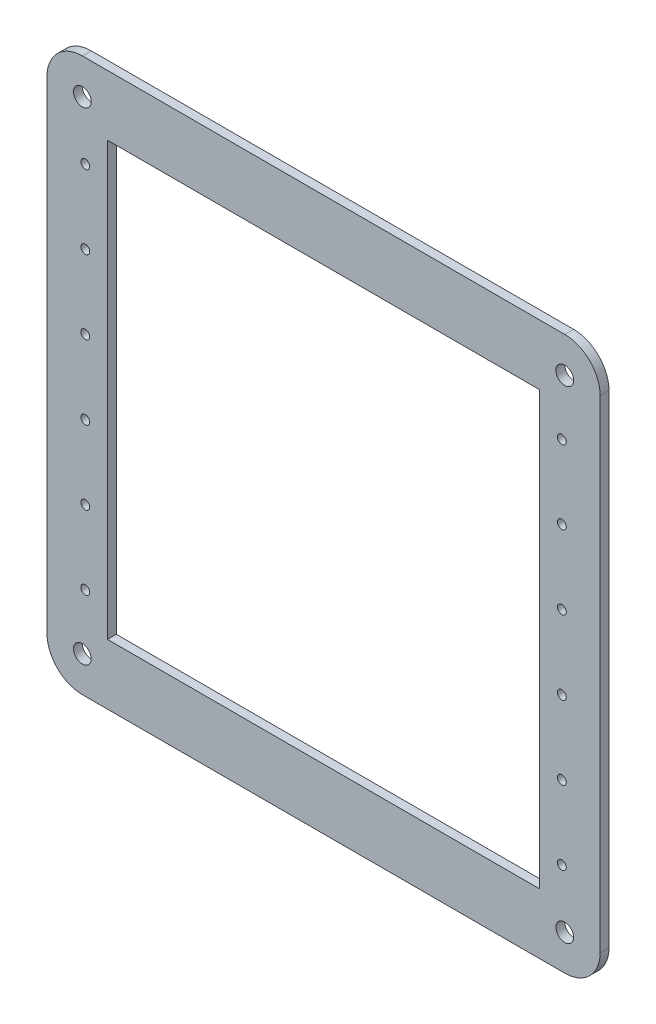
ISO-10303-21;
HEADER;
FILE_DESCRIPTION(('STEP AP214'),'2;1');
FILE_NAME('part.step','',(''),(''),'','','');
FILE_SCHEMA(('AUTOMOTIVE_DESIGN { 1 0 10303 214 1 1 1 1 }'));
ENDSEC;
DATA;
#1=APPLICATION_CONTEXT('core data for automotive mechanical design processes');
#2=APPLICATION_PROTOCOL_DEFINITION('international standard','automotive_design',2000,#1);
#3=PRODUCT_CONTEXT('',#1,'mechanical');
#4=PRODUCT('Part','Part','',(#3));
#5=PRODUCT_RELATED_PRODUCT_CATEGORY('part','',(#4));
#6=PRODUCT_DEFINITION_FORMATION('','',#4);
#7=PRODUCT_DEFINITION_CONTEXT('part definition',#1,'design');
#8=PRODUCT_DEFINITION('design','',#6,#7);
#9=PRODUCT_DEFINITION_SHAPE('','',#8);
#10=(LENGTH_UNIT() NAMED_UNIT(*) SI_UNIT(.MILLI.,.METRE.));
#11=(NAMED_UNIT(*) PLANE_ANGLE_UNIT() SI_UNIT($,.RADIAN.));
#12=(NAMED_UNIT(*) SI_UNIT($,.STERADIAN.) SOLID_ANGLE_UNIT());
#13=UNCERTAINTY_MEASURE_WITH_UNIT(LENGTH_MEASURE(1.E-05),#10,'distance_accuracy_value','');
#14=(GEOMETRIC_REPRESENTATION_CONTEXT(3) GLOBAL_UNCERTAINTY_ASSIGNED_CONTEXT((#13)) GLOBAL_UNIT_ASSIGNED_CONTEXT((#10,
#11,#12)) REPRESENTATION_CONTEXT('',''));
#15=CARTESIAN_POINT('',(0.,0.,0.));
#16=DIRECTION('',(0.,0.,1.));
#17=DIRECTION('',(1.,0.,0.));
#18=AXIS2_PLACEMENT_3D('',#15,#16,#17);
#19=CARTESIAN_POINT('',(-109.,-109.,4.));
#20=DIRECTION('',(0.,0.,1.));
#21=DIRECTION('',(1.,0.,0.));
#22=AXIS2_PLACEMENT_3D('',#19,#20,#21);
#23=PLANE('',#22);
#24=CARTESIAN_POINT('',(107.686291501015,-16.7000000000003,4.));
#25=DIRECTION('',(0.,0.,1.));
#26=DIRECTION('',(1.,0.,0.));
#27=AXIS2_PLACEMENT_3D('',#24,#25,#26);
#28=CIRCLE('',#27,2.);
#29=CARTESIAN_POINT('',(109.686291501015,-16.7000000000003,4.));
#30=VERTEX_POINT('',#29);
#31=EDGE_CURVE('E614',#30,#30,#28,.T.);
#32=ORIENTED_EDGE('',*,*,#31,.F.);
#33=EDGE_LOOP('',(#32));
#34=FACE_BOUND('',#33,.T.);
#35=CARTESIAN_POINT('',(107.686291501015,-50.0000000000003,4.));
#36=DIRECTION('',(0.,0.,1.));
#37=DIRECTION('',(1.,0.,0.));
#38=AXIS2_PLACEMENT_3D('',#35,#36,#37);
#39=CIRCLE('',#38,2.);
#40=CARTESIAN_POINT('',(109.686291501015,-50.0000000000003,4.));
#41=VERTEX_POINT('',#40);
#42=EDGE_CURVE('E615',#41,#41,#39,.T.);
#43=ORIENTED_EDGE('',*,*,#42,.F.);
#44=EDGE_LOOP('',(#43));
#45=FACE_BOUND('',#44,.T.);
#46=CARTESIAN_POINT('',(107.686291501015,-83.3000000000003,4.));
#47=DIRECTION('',(0.,0.,1.));
#48=DIRECTION('',(1.,0.,0.));
#49=AXIS2_PLACEMENT_3D('',#46,#47,#48);
#50=CIRCLE('',#49,2.00000000000001);
#51=CARTESIAN_POINT('',(109.686291501015,-83.3000000000003,4.));
#52=VERTEX_POINT('',#51);
#53=EDGE_CURVE('E619',#52,#52,#50,.T.);
#54=ORIENTED_EDGE('',*,*,#53,.F.);
#55=EDGE_LOOP('',(#54));
#56=FACE_BOUND('',#55,.T.);
#57=CARTESIAN_POINT('',(-107.686291501015,-83.3000000000003,4.));
#58=DIRECTION('',(0.,0.,1.));
#59=DIRECTION('',(1.,0.,0.));
#60=AXIS2_PLACEMENT_3D('',#57,#58,#59);
#61=CIRCLE('',#60,2.);
#62=CARTESIAN_POINT('',(-105.686291501015,-83.3000000000003,4.));
#63=VERTEX_POINT('',#62);
#64=EDGE_CURVE('E637',#63,#63,#61,.T.);
#65=ORIENTED_EDGE('',*,*,#64,.F.);
#66=EDGE_LOOP('',(#65));
#67=FACE_BOUND('',#66,.T.);
#68=CARTESIAN_POINT('',(-107.686291501015,-50.0000000000003,4.));
#69=DIRECTION('',(0.,0.,1.));
#70=DIRECTION('',(1.,0.,0.));
#71=AXIS2_PLACEMENT_3D('',#68,#69,#70);
#72=CIRCLE('',#71,2.00000000000001);
#73=CARTESIAN_POINT('',(-105.686291501015,-50.0000000000003,4.));
#74=VERTEX_POINT('',#73);
#75=EDGE_CURVE('E635',#74,#74,#72,.T.);
#76=ORIENTED_EDGE('',*,*,#75,.F.);
#77=EDGE_LOOP('',(#76));
#78=FACE_BOUND('',#77,.T.);
#79=CARTESIAN_POINT('',(-107.686291501015,-16.7000000000003,4.));
#80=DIRECTION('',(0.,0.,1.));
#81=DIRECTION('',(1.,0.,0.));
#82=AXIS2_PLACEMENT_3D('',#79,#80,#81);
#83=CIRCLE('',#82,2.);
#84=CARTESIAN_POINT('',(-105.686291501015,-16.7000000000003,4.));
#85=VERTEX_POINT('',#84);
#86=EDGE_CURVE('E632',#85,#85,#83,.T.);
#87=ORIENTED_EDGE('',*,*,#86,.F.);
#88=EDGE_LOOP('',(#87));
#89=FACE_BOUND('',#88,.T.);
#90=CARTESIAN_POINT('',(-107.686291501015,16.7000000000004,4.));
#91=DIRECTION('',(0.,0.,1.));
#92=DIRECTION('',(1.,0.,0.));
#93=AXIS2_PLACEMENT_3D('',#90,#91,#92);
#94=CIRCLE('',#93,2.00000000000001);
#95=CARTESIAN_POINT('',(-105.686291501015,16.7000000000004,4.));
#96=VERTEX_POINT('',#95);
#97=EDGE_CURVE('E629',#96,#96,#94,.T.);
#98=ORIENTED_EDGE('',*,*,#97,.F.);
#99=EDGE_LOOP('',(#98));
#100=FACE_BOUND('',#99,.T.);
#101=CARTESIAN_POINT('',(-107.686291501015,50.0000000000004,4.));
#102=DIRECTION('',(0.,0.,1.));
#103=DIRECTION('',(1.,0.,0.));
#104=AXIS2_PLACEMENT_3D('',#101,#102,#103);
#105=CIRCLE('',#104,2.);
#106=CARTESIAN_POINT('',(-105.686291501015,50.0000000000004,4.));
#107=VERTEX_POINT('',#106);
#108=EDGE_CURVE('E626',#107,#107,#105,.T.);
#109=ORIENTED_EDGE('',*,*,#108,.F.);
#110=EDGE_LOOP('',(#109));
#111=FACE_BOUND('',#110,.T.);
#112=CARTESIAN_POINT('',(107.686291501015,16.7000000000004,4.));
#113=DIRECTION('',(0.,0.,1.));
#114=DIRECTION('',(1.,0.,0.));
#115=AXIS2_PLACEMENT_3D('',#112,#113,#114);
#116=CIRCLE('',#115,2.);
#117=CARTESIAN_POINT('',(109.686291501015,16.7000000000004,4.));
#118=VERTEX_POINT('',#117);
#119=EDGE_CURVE('E616',#118,#118,#116,.T.);
#120=ORIENTED_EDGE('',*,*,#119,.F.);
#121=EDGE_LOOP('',(#120));
#122=FACE_BOUND('',#121,.T.);
#123=CARTESIAN_POINT('',(107.686291501015,50.0000000000004,4.));
#124=DIRECTION('',(0.,0.,1.));
#125=DIRECTION('',(1.,0.,0.));
#126=AXIS2_PLACEMENT_3D('',#123,#124,#125);
#127=CIRCLE('',#126,2.00000000000001);
#128=CARTESIAN_POINT('',(109.686291501015,50.0000000000004,4.));
#129=VERTEX_POINT('',#128);
#130=EDGE_CURVE('E622',#129,#129,#127,.T.);
#131=ORIENTED_EDGE('',*,*,#130,.F.);
#132=EDGE_LOOP('',(#131));
#133=FACE_BOUND('',#132,.T.);
#134=CARTESIAN_POINT('',(107.686291501015,83.3000000000004,4.));
#135=DIRECTION('',(0.,0.,1.));
#136=DIRECTION('',(1.,0.,0.));
#137=AXIS2_PLACEMENT_3D('',#134,#135,#136);
#138=CIRCLE('',#137,2.);
#139=CARTESIAN_POINT('',(109.686291501015,83.3000000000004,4.));
#140=VERTEX_POINT('',#139);
#141=EDGE_CURVE('E650',#140,#140,#138,.T.);
#142=ORIENTED_EDGE('',*,*,#141,.F.);
#143=EDGE_LOOP('',(#142));
#144=FACE_BOUND('',#143,.T.);
#145=CARTESIAN_POINT('',(-107.686291501015,83.3000000000004,4.));
#146=DIRECTION('',(0.,0.,1.));
#147=DIRECTION('',(1.,0.,0.));
#148=AXIS2_PLACEMENT_3D('',#145,#146,#147);
#149=CIRCLE('',#148,2.00000000000001);
#150=CARTESIAN_POINT('',(-105.686291501015,83.3000000000004,4.));
#151=VERTEX_POINT('',#150);
#152=EDGE_CURVE('E224',#151,#151,#149,.T.);
#153=ORIENTED_EDGE('',*,*,#152,.F.);
#154=EDGE_LOOP('',(#153));
#155=FACE_BOUND('',#154,.T.);
#156=CARTESIAN_POINT('',(109.,-109.,4.));
#157=DIRECTION('',(0.,0.,1.));
#158=DIRECTION('',(1.,0.,0.));
#159=AXIS2_PLACEMENT_3D('',#156,#157,#158);
#160=CIRCLE('',#159,4.00000000000001);
#161=CARTESIAN_POINT('',(113.,-109.,4.));
#162=VERTEX_POINT('',#161);
#163=EDGE_CURVE('E268',#162,#162,#160,.T.);
#164=ORIENTED_EDGE('',*,*,#163,.F.);
#165=EDGE_LOOP('',(#164));
#166=FACE_BOUND('',#165,.T.);
#167=CARTESIAN_POINT('',(-109.,109.,4.));
#168=DIRECTION('',(0.,0.,1.));
#169=DIRECTION('',(1.,0.,0.));
#170=AXIS2_PLACEMENT_3D('',#167,#168,#169);
#171=CIRCLE('',#170,4.00000000000001);
#172=CARTESIAN_POINT('',(-105.,109.,4.));
#173=VERTEX_POINT('',#172);
#174=EDGE_CURVE('E157',#173,#173,#171,.T.);
#175=ORIENTED_EDGE('',*,*,#174,.F.);
#176=EDGE_LOOP('',(#175));
#177=FACE_BOUND('',#176,.T.);
#178=CARTESIAN_POINT('',(-109.,-109.,4.));
#179=DIRECTION('',(0.,0.,1.));
#180=DIRECTION('',(1.,0.,0.));
#181=AXIS2_PLACEMENT_3D('',#178,#179,#180);
#182=CIRCLE('',#181,16.);
#183=CARTESIAN_POINT('',(-125.,-109.,4.));
#184=VERTEX_POINT('',#183);
#185=CARTESIAN_POINT('',(-109.,-125.,4.));
#186=VERTEX_POINT('',#185);
#187=EDGE_CURVE('E167',#184,#186,#182,.T.);
#188=ORIENTED_EDGE('',*,*,#187,.T.);
#189=DIRECTION('',(1.,0.,0.));
#190=VECTOR('',#189,1.);
#191=CARTESIAN_POINT('',(-109.,-125.,4.));
#192=LINE('',#191,#190);
#193=CARTESIAN_POINT('',(109.,-125.,4.));
#194=VERTEX_POINT('',#193);
#195=EDGE_CURVE('E170',#186,#194,#192,.T.);
#196=ORIENTED_EDGE('',*,*,#195,.T.);
#197=CARTESIAN_POINT('',(109.,-109.,4.));
#198=DIRECTION('',(0.,0.,1.));
#199=DIRECTION('',(1.,0.,0.));
#200=AXIS2_PLACEMENT_3D('',#197,#198,#199);
#201=CIRCLE('',#200,16.);
#202=CARTESIAN_POINT('',(125.,-109.,4.));
#203=VERTEX_POINT('',#202);
#204=EDGE_CURVE('E173',#194,#203,#201,.T.);
#205=ORIENTED_EDGE('',*,*,#204,.T.);
#206=DIRECTION('',(0.,1.,0.));
#207=VECTOR('',#206,1.);
#208=CARTESIAN_POINT('',(125.,109.,4.));
#209=LINE('',#208,#207);
#210=CARTESIAN_POINT('',(125.,109.,4.));
#211=VERTEX_POINT('',#210);
#212=EDGE_CURVE('E175',#203,#211,#209,.T.);
#213=ORIENTED_EDGE('',*,*,#212,.T.);
#214=CARTESIAN_POINT('',(109.,109.,4.));
#215=DIRECTION('',(0.,0.,1.));
#216=DIRECTION('',(-1.,0.,0.));
#217=AXIS2_PLACEMENT_3D('',#214,#215,#216);
#218=CIRCLE('',#217,16.);
#219=CARTESIAN_POINT('',(109.,125.,4.));
#220=VERTEX_POINT('',#219);
#221=EDGE_CURVE('E177',#211,#220,#218,.T.);
#222=ORIENTED_EDGE('',*,*,#221,.T.);
#223=DIRECTION('',(-1.,0.,0.));
#224=VECTOR('',#223,1.);
#225=CARTESIAN_POINT('',(-109.,125.,4.));
#226=LINE('',#225,#224);
#227=CARTESIAN_POINT('',(-109.,125.,4.));
#228=VERTEX_POINT('',#227);
#229=EDGE_CURVE('E179',#220,#228,#226,.T.);
#230=ORIENTED_EDGE('',*,*,#229,.T.);
#231=CARTESIAN_POINT('',(-109.,109.,4.));
#232=DIRECTION('',(0.,0.,1.));
#233=DIRECTION('',(1.,0.,0.));
#234=AXIS2_PLACEMENT_3D('',#231,#232,#233);
#235=CIRCLE('',#234,16.);
#236=CARTESIAN_POINT('',(-125.,109.,4.));
#237=VERTEX_POINT('',#236);
#238=EDGE_CURVE('E181',#228,#237,#235,.T.);
#239=ORIENTED_EDGE('',*,*,#238,.T.);
#240=DIRECTION('',(0.,-1.,0.));
#241=VECTOR('',#240,1.);
#242=CARTESIAN_POINT('',(-125.,109.,4.));
#243=LINE('',#242,#241);
#244=EDGE_CURVE('E183',#237,#184,#243,.T.);
#245=ORIENTED_EDGE('',*,*,#244,.T.);
#246=EDGE_LOOP('',(#188,#196,#205,#213,#222,#230,#239,#245));
#247=FACE_BOUND('',#246,.T.);
#248=DIRECTION('',(1.,0.,0.));
#249=VECTOR('',#248,1.);
#250=CARTESIAN_POINT('',(97.6862915010152,-97.6862915010152,4.));
#251=LINE('',#250,#249);
#252=CARTESIAN_POINT('',(-97.6862915010153,-97.6862915010152,4.));
#253=VERTEX_POINT('',#252);
#254=CARTESIAN_POINT('',(97.6862915010152,-97.6862915010152,4.));
#255=VERTEX_POINT('',#254);
#256=EDGE_CURVE('E136',#253,#255,#251,.T.);
#257=ORIENTED_EDGE('',*,*,#256,.F.);
#258=DIRECTION('',(0.,-1.,0.));
#259=VECTOR('',#258,1.);
#260=CARTESIAN_POINT('',(-97.6862915010153,-97.6862915010152,4.));
#261=LINE('',#260,#259);
#262=CARTESIAN_POINT('',(-97.6862915010153,97.6862915010152,4.));
#263=VERTEX_POINT('',#262);
#264=EDGE_CURVE('E128',#263,#253,#261,.T.);
#265=ORIENTED_EDGE('',*,*,#264,.F.);
#266=DIRECTION('',(-1.,0.,0.));
#267=VECTOR('',#266,1.);
#268=CARTESIAN_POINT('',(-97.6862915010153,97.6862915010152,4.));
#269=LINE('',#268,#267);
#270=CARTESIAN_POINT('',(97.6862915010152,97.6862915010152,4.));
#271=VERTEX_POINT('',#270);
#272=EDGE_CURVE('E151',#271,#263,#269,.T.);
#273=ORIENTED_EDGE('',*,*,#272,.F.);
#274=DIRECTION('',(0.,1.,0.));
#275=VECTOR('',#274,1.);
#276=CARTESIAN_POINT('',(97.6862915010152,97.6862915010152,4.));
#277=LINE('',#276,#275);
#278=EDGE_CURVE('E149',#255,#271,#277,.T.);
#279=ORIENTED_EDGE('',*,*,#278,.F.);
#280=EDGE_LOOP('',(#257,#265,#273,#279));
#281=FACE_BOUND('',#280,.T.);
#282=CARTESIAN_POINT('',(109.,109.,4.));
#283=DIRECTION('',(0.,0.,1.));
#284=DIRECTION('',(1.,0.,0.));
#285=AXIS2_PLACEMENT_3D('',#282,#283,#284);
#286=CIRCLE('',#285,4.00000000000001);
#287=CARTESIAN_POINT('',(113.,109.,4.));
#288=VERTEX_POINT('',#287);
#289=EDGE_CURVE('E274',#288,#288,#286,.T.);
#290=ORIENTED_EDGE('',*,*,#289,.F.);
#291=EDGE_LOOP('',(#290));
#292=FACE_BOUND('',#291,.T.);
#293=CARTESIAN_POINT('',(-109.,-109.,4.));
#294=DIRECTION('',(0.,0.,1.));
#295=DIRECTION('',(1.,0.,0.));
#296=AXIS2_PLACEMENT_3D('',#293,#294,#295);
#297=CIRCLE('',#296,4.00000000000001);
#298=CARTESIAN_POINT('',(-105.,-109.,4.));
#299=VERTEX_POINT('',#298);
#300=EDGE_CURVE('E259',#299,#299,#297,.T.);
#301=ORIENTED_EDGE('',*,*,#300,.F.);
#302=EDGE_LOOP('',(#301));
#303=FACE_BOUND('',#302,.T.);
#304=ADVANCED_FACE('F37',(#34,#45,#56,#67,#78,#89,#100,#111,#122,#133,#144,#155,#166,#177,#247,
#281,#292,#303),#23,.T.);
#305=CARTESIAN_POINT('',(-109.,-109.,0.));
#306=DIRECTION('',(0.,0.,1.));
#307=DIRECTION('',(1.,0.,0.));
#308=AXIS2_PLACEMENT_3D('',#305,#306,#307);
#309=PLANE('',#308);
#310=CARTESIAN_POINT('',(107.686291501015,-16.7000000000003,0.));
#311=DIRECTION('',(0.,0.,1.));
#312=DIRECTION('',(1.,0.,0.));
#313=AXIS2_PLACEMENT_3D('',#310,#311,#312);
#314=CIRCLE('',#313,2.);
#315=CARTESIAN_POINT('',(109.686291501015,-16.7000000000003,0.));
#316=VERTEX_POINT('',#315);
#317=EDGE_CURVE('E41',#316,#316,#314,.T.);
#318=ORIENTED_EDGE('',*,*,#317,.T.);
#319=EDGE_LOOP('',(#318));
#320=FACE_BOUND('',#319,.T.);
#321=CARTESIAN_POINT('',(107.686291501015,-50.0000000000003,0.));
#322=DIRECTION('',(0.,0.,1.));
#323=DIRECTION('',(1.,0.,0.));
#324=AXIS2_PLACEMENT_3D('',#321,#322,#323);
#325=CIRCLE('',#324,2.);
#326=CARTESIAN_POINT('',(109.686291501015,-50.0000000000003,0.));
#327=VERTEX_POINT('',#326);
#328=EDGE_CURVE('E250',#327,#327,#325,.T.);
#329=ORIENTED_EDGE('',*,*,#328,.T.);
#330=EDGE_LOOP('',(#329));
#331=FACE_BOUND('',#330,.T.);
#332=CARTESIAN_POINT('',(107.686291501015,-83.3000000000003,0.));
#333=DIRECTION('',(0.,0.,1.));
#334=DIRECTION('',(1.,0.,0.));
#335=AXIS2_PLACEMENT_3D('',#332,#333,#334);
#336=CIRCLE('',#335,2.00000000000001);
#337=CARTESIAN_POINT('',(109.686291501015,-83.3000000000003,0.));
#338=VERTEX_POINT('',#337);
#339=EDGE_CURVE('E248',#338,#338,#336,.T.);
#340=ORIENTED_EDGE('',*,*,#339,.T.);
#341=EDGE_LOOP('',(#340));
#342=FACE_BOUND('',#341,.T.);
#343=CARTESIAN_POINT('',(-107.686291501015,-83.3000000000003,0.));
#344=DIRECTION('',(0.,0.,1.));
#345=DIRECTION('',(1.,0.,0.));
#346=AXIS2_PLACEMENT_3D('',#343,#344,#345);
#347=CIRCLE('',#346,2.);
#348=CARTESIAN_POINT('',(-105.686291501015,-83.3000000000003,0.));
#349=VERTEX_POINT('',#348);
#350=EDGE_CURVE('E245',#349,#349,#347,.T.);
#351=ORIENTED_EDGE('',*,*,#350,.T.);
#352=EDGE_LOOP('',(#351));
#353=FACE_BOUND('',#352,.T.);
#354=CARTESIAN_POINT('',(-107.686291501015,-50.0000000000003,0.));
#355=DIRECTION('',(0.,0.,1.));
#356=DIRECTION('',(1.,0.,0.));
#357=AXIS2_PLACEMENT_3D('',#354,#355,#356);
#358=CIRCLE('',#357,2.00000000000001);
#359=CARTESIAN_POINT('',(-105.686291501015,-50.0000000000003,0.));
#360=VERTEX_POINT('',#359);
#361=EDGE_CURVE('E242',#360,#360,#358,.T.);
#362=ORIENTED_EDGE('',*,*,#361,.T.);
#363=EDGE_LOOP('',(#362));
#364=FACE_BOUND('',#363,.T.);
#365=CARTESIAN_POINT('',(-107.686291501015,-16.7000000000003,0.));
#366=DIRECTION('',(0.,0.,1.));
#367=DIRECTION('',(1.,0.,0.));
#368=AXIS2_PLACEMENT_3D('',#365,#366,#367);
#369=CIRCLE('',#368,2.);
#370=CARTESIAN_POINT('',(-105.686291501015,-16.7000000000003,0.));
#371=VERTEX_POINT('',#370);
#372=EDGE_CURVE('E239',#371,#371,#369,.T.);
#373=ORIENTED_EDGE('',*,*,#372,.T.);
#374=EDGE_LOOP('',(#373));
#375=FACE_BOUND('',#374,.T.);
#376=CARTESIAN_POINT('',(-107.686291501015,16.7000000000004,0.));
#377=DIRECTION('',(0.,0.,1.));
#378=DIRECTION('',(1.,0.,0.));
#379=AXIS2_PLACEMENT_3D('',#376,#377,#378);
#380=CIRCLE('',#379,2.00000000000001);
#381=CARTESIAN_POINT('',(-105.686291501015,16.7000000000004,0.));
#382=VERTEX_POINT('',#381);
#383=EDGE_CURVE('E236',#382,#382,#380,.T.);
#384=ORIENTED_EDGE('',*,*,#383,.T.);
#385=EDGE_LOOP('',(#384));
#386=FACE_BOUND('',#385,.T.);
#387=CARTESIAN_POINT('',(-107.686291501015,50.0000000000004,0.));
#388=DIRECTION('',(0.,0.,1.));
#389=DIRECTION('',(1.,0.,0.));
#390=AXIS2_PLACEMENT_3D('',#387,#388,#389);
#391=CIRCLE('',#390,2.);
#392=CARTESIAN_POINT('',(-105.686291501015,50.0000000000004,0.));
#393=VERTEX_POINT('',#392);
#394=EDGE_CURVE('E233',#393,#393,#391,.T.);
#395=ORIENTED_EDGE('',*,*,#394,.T.);
#396=EDGE_LOOP('',(#395));
#397=FACE_BOUND('',#396,.T.);
#398=CARTESIAN_POINT('',(107.686291501015,16.7000000000004,0.));
#399=DIRECTION('',(0.,0.,1.));
#400=DIRECTION('',(1.,0.,0.));
#401=AXIS2_PLACEMENT_3D('',#398,#399,#400);
#402=CIRCLE('',#401,2.);
#403=CARTESIAN_POINT('',(109.686291501015,16.7000000000004,0.));
#404=VERTEX_POINT('',#403);
#405=EDGE_CURVE('E230',#404,#404,#402,.T.);
#406=ORIENTED_EDGE('',*,*,#405,.T.);
#407=EDGE_LOOP('',(#406));
#408=FACE_BOUND('',#407,.T.);
#409=CARTESIAN_POINT('',(107.686291501015,50.0000000000004,0.));
#410=DIRECTION('',(0.,0.,1.));
#411=DIRECTION('',(1.,0.,0.));
#412=AXIS2_PLACEMENT_3D('',#409,#410,#411);
#413=CIRCLE('',#412,2.00000000000001);
#414=CARTESIAN_POINT('',(109.686291501015,50.0000000000004,0.));
#415=VERTEX_POINT('',#414);
#416=EDGE_CURVE('E227',#415,#415,#413,.T.);
#417=ORIENTED_EDGE('',*,*,#416,.T.);
#418=EDGE_LOOP('',(#417));
#419=FACE_BOUND('',#418,.T.);
#420=CARTESIAN_POINT('',(107.686291501015,83.3000000000004,0.));
#421=DIRECTION('',(0.,0.,1.));
#422=DIRECTION('',(1.,0.,0.));
#423=AXIS2_PLACEMENT_3D('',#420,#421,#422);
#424=CIRCLE('',#423,2.);
#425=CARTESIAN_POINT('',(109.686291501015,83.3000000000004,0.));
#426=VERTEX_POINT('',#425);
#427=EDGE_CURVE('E223',#426,#426,#424,.T.);
#428=ORIENTED_EDGE('',*,*,#427,.T.);
#429=EDGE_LOOP('',(#428));
#430=FACE_BOUND('',#429,.T.);
#431=CARTESIAN_POINT('',(-107.686291501015,83.3000000000004,0.));
#432=DIRECTION('',(0.,0.,1.));
#433=DIRECTION('',(1.,0.,0.));
#434=AXIS2_PLACEMENT_3D('',#431,#432,#433);
#435=CIRCLE('',#434,2.00000000000001);
#436=CARTESIAN_POINT('',(-105.686291501015,83.3000000000004,0.));
#437=VERTEX_POINT('',#436);
#438=EDGE_CURVE('E220',#437,#437,#435,.T.);
#439=ORIENTED_EDGE('',*,*,#438,.T.);
#440=EDGE_LOOP('',(#439));
#441=FACE_BOUND('',#440,.T.);
#442=CARTESIAN_POINT('',(-109.,-109.,0.));
#443=DIRECTION('',(0.,0.,1.));
#444=DIRECTION('',(1.,0.,0.));
#445=AXIS2_PLACEMENT_3D('',#442,#443,#444);
#446=CIRCLE('',#445,16.);
#447=CARTESIAN_POINT('',(-125.,-109.,0.));
#448=VERTEX_POINT('',#447);
#449=CARTESIAN_POINT('',(-109.,-125.,0.));
#450=VERTEX_POINT('',#449);
#451=EDGE_CURVE('E144',#448,#450,#446,.T.);
#452=ORIENTED_EDGE('',*,*,#451,.F.);
#453=DIRECTION('',(0.,-1.,0.));
#454=VECTOR('',#453,1.);
#455=CARTESIAN_POINT('',(-125.,109.,0.));
#456=LINE('',#455,#454);
#457=CARTESIAN_POINT('',(-125.,109.,0.));
#458=VERTEX_POINT('',#457);
#459=EDGE_CURVE('E171',#458,#448,#456,.T.);
#460=ORIENTED_EDGE('',*,*,#459,.F.);
#461=CARTESIAN_POINT('',(-109.,109.,0.));
#462=DIRECTION('',(0.,0.,1.));
#463=DIRECTION('',(1.,0.,0.));
#464=AXIS2_PLACEMENT_3D('',#461,#462,#463);
#465=CIRCLE('',#464,16.);
#466=CARTESIAN_POINT('',(-109.,125.,0.));
#467=VERTEX_POINT('',#466);
#468=EDGE_CURVE('E198',#467,#458,#465,.T.);
#469=ORIENTED_EDGE('',*,*,#468,.F.);
#470=DIRECTION('',(-1.,0.,0.));
#471=VECTOR('',#470,1.);
#472=CARTESIAN_POINT('',(-109.,125.,0.));
#473=LINE('',#472,#471);
#474=CARTESIAN_POINT('',(109.,125.,0.));
#475=VERTEX_POINT('',#474);
#476=EDGE_CURVE('E196',#475,#467,#473,.T.);
#477=ORIENTED_EDGE('',*,*,#476,.F.);
#478=CARTESIAN_POINT('',(109.,109.,0.));
#479=DIRECTION('',(0.,0.,1.));
#480=DIRECTION('',(-1.,0.,0.));
#481=AXIS2_PLACEMENT_3D('',#478,#479,#480);
#482=CIRCLE('',#481,16.);
#483=CARTESIAN_POINT('',(125.,109.,0.));
#484=VERTEX_POINT('',#483);
#485=EDGE_CURVE('E194',#484,#475,#482,.T.);
#486=ORIENTED_EDGE('',*,*,#485,.F.);
#487=DIRECTION('',(0.,1.,0.));
#488=VECTOR('',#487,1.);
#489=CARTESIAN_POINT('',(125.,109.,0.));
#490=LINE('',#489,#488);
#491=CARTESIAN_POINT('',(125.,-109.,0.));
#492=VERTEX_POINT('',#491);
#493=EDGE_CURVE('E192',#492,#484,#490,.T.);
#494=ORIENTED_EDGE('',*,*,#493,.F.);
#495=CARTESIAN_POINT('',(109.,-109.,0.));
#496=DIRECTION('',(0.,0.,1.));
#497=DIRECTION('',(1.,0.,0.));
#498=AXIS2_PLACEMENT_3D('',#495,#496,#497);
#499=CIRCLE('',#498,16.);
#500=CARTESIAN_POINT('',(109.,-125.,0.));
#501=VERTEX_POINT('',#500);
#502=EDGE_CURVE('E190',#501,#492,#499,.T.);
#503=ORIENTED_EDGE('',*,*,#502,.F.);
#504=DIRECTION('',(1.,0.,0.));
#505=VECTOR('',#504,1.);
#506=CARTESIAN_POINT('',(-109.,-125.,0.));
#507=LINE('',#506,#505);
#508=EDGE_CURVE('E188',#450,#501,#507,.T.);
#509=ORIENTED_EDGE('',*,*,#508,.F.);
#510=EDGE_LOOP('',(#452,#460,#469,#477,#486,#494,#503,#509));
#511=FACE_BOUND('',#510,.T.);
#512=DIRECTION('',(0.,-1.,0.));
#513=VECTOR('',#512,1.);
#514=CARTESIAN_POINT('',(-97.6862915010153,-97.6862915010152,0.));
#515=LINE('',#514,#513);
#516=CARTESIAN_POINT('',(-97.6862915010153,97.6862915010152,0.));
#517=VERTEX_POINT('',#516);
#518=CARTESIAN_POINT('',(-97.6862915010153,-97.6862915010152,0.));
#519=VERTEX_POINT('',#518);
#520=EDGE_CURVE('E62',#517,#519,#515,.T.);
#521=ORIENTED_EDGE('',*,*,#520,.T.);
#522=DIRECTION('',(1.,0.,0.));
#523=VECTOR('',#522,1.);
#524=CARTESIAN_POINT('',(97.6862915010152,-97.6862915010152,0.));
#525=LINE('',#524,#523);
#526=CARTESIAN_POINT('',(97.6862915010152,-97.6862915010152,0.));
#527=VERTEX_POINT('',#526);
#528=EDGE_CURVE('E143',#519,#527,#525,.T.);
#529=ORIENTED_EDGE('',*,*,#528,.T.);
#530=DIRECTION('',(0.,1.,0.));
#531=VECTOR('',#530,1.);
#532=CARTESIAN_POINT('',(97.6862915010152,97.6862915010152,0.));
#533=LINE('',#532,#531);
#534=CARTESIAN_POINT('',(97.6862915010152,97.6862915010152,0.));
#535=VERTEX_POINT('',#534);
#536=EDGE_CURVE('E159',#527,#535,#533,.T.);
#537=ORIENTED_EDGE('',*,*,#536,.T.);
#538=DIRECTION('',(-1.,0.,0.));
#539=VECTOR('',#538,1.);
#540=CARTESIAN_POINT('',(-97.6862915010153,97.6862915010152,0.));
#541=LINE('',#540,#539);
#542=EDGE_CURVE('E137',#535,#517,#541,.T.);
#543=ORIENTED_EDGE('',*,*,#542,.T.);
#544=EDGE_LOOP('',(#521,#529,#537,#543));
#545=FACE_BOUND('',#544,.T.);
#546=CARTESIAN_POINT('',(-109.,109.,0.));
#547=DIRECTION('',(0.,0.,1.));
#548=DIRECTION('',(1.,0.,0.));
#549=AXIS2_PLACEMENT_3D('',#546,#547,#548);
#550=CIRCLE('',#549,4.00000000000001);
#551=CARTESIAN_POINT('',(-105.,109.,0.));
#552=VERTEX_POINT('',#551);
#553=EDGE_CURVE('E277',#552,#552,#550,.T.);
#554=ORIENTED_EDGE('',*,*,#553,.T.);
#555=EDGE_LOOP('',(#554));
#556=FACE_BOUND('',#555,.T.);
#557=CARTESIAN_POINT('',(109.,109.,0.));
#558=DIRECTION('',(0.,0.,1.));
#559=DIRECTION('',(1.,0.,0.));
#560=AXIS2_PLACEMENT_3D('',#557,#558,#559);
#561=CIRCLE('',#560,4.00000000000001);
#562=CARTESIAN_POINT('',(113.,109.,0.));
#563=VERTEX_POINT('',#562);
#564=EDGE_CURVE('E271',#563,#563,#561,.T.);
#565=ORIENTED_EDGE('',*,*,#564,.T.);
#566=EDGE_LOOP('',(#565));
#567=FACE_BOUND('',#566,.T.);
#568=CARTESIAN_POINT('',(109.,-109.,0.));
#569=DIRECTION('',(0.,0.,1.));
#570=DIRECTION('',(1.,0.,0.));
#571=AXIS2_PLACEMENT_3D('',#568,#569,#570);
#572=CIRCLE('',#571,4.00000000000001);
#573=CARTESIAN_POINT('',(113.,-109.,0.));
#574=VERTEX_POINT('',#573);
#575=EDGE_CURVE('E264',#574,#574,#572,.T.);
#576=ORIENTED_EDGE('',*,*,#575,.T.);
#577=EDGE_LOOP('',(#576));
#578=FACE_BOUND('',#577,.T.);
#579=CARTESIAN_POINT('',(-109.,-109.,0.));
#580=DIRECTION('',(0.,0.,1.));
#581=DIRECTION('',(1.,0.,0.));
#582=AXIS2_PLACEMENT_3D('',#579,#580,#581);
#583=CIRCLE('',#582,4.00000000000001);
#584=CARTESIAN_POINT('',(-105.,-109.,0.));
#585=VERTEX_POINT('',#584);
#586=EDGE_CURVE('E255',#585,#585,#583,.T.);
#587=ORIENTED_EDGE('',*,*,#586,.T.);
#588=EDGE_LOOP('',(#587));
#589=FACE_BOUND('',#588,.T.);
#590=ADVANCED_FACE('F284',(#320,#331,#342,#353,#364,#375,#386,#397,#408,#419,#430,#441,#511,
#545,#556,#567,#578,#589),#309,.F.);
#591=CARTESIAN_POINT('',(-109.,-109.,4.));
#592=DIRECTION('',(0.,0.,-1.));
#593=DIRECTION('',(-1.,0.,0.));
#594=AXIS2_PLACEMENT_3D('',#591,#592,#593);
#595=CYLINDRICAL_SURFACE('',#594,16.);
#596=ORIENTED_EDGE('',*,*,#451,.T.);
#597=DIRECTION('',(0.,0.,-1.));
#598=VECTOR('',#597,1.);
#599=CARTESIAN_POINT('',(-109.,-125.,4.));
#600=LINE('',#599,#598);
#601=EDGE_CURVE('E11',#186,#450,#600,.T.);
#602=ORIENTED_EDGE('',*,*,#601,.F.);
#603=ORIENTED_EDGE('',*,*,#187,.F.);
#604=DIRECTION('',(0.,0.,-1.));
#605=VECTOR('',#604,1.);
#606=CARTESIAN_POINT('',(-125.,-109.,4.));
#607=LINE('',#606,#605);
#608=EDGE_CURVE('E185',#184,#448,#607,.T.);
#609=ORIENTED_EDGE('',*,*,#608,.T.);
#610=EDGE_LOOP('',(#596,#602,#603,#609));
#611=FACE_BOUND('',#610,.T.);
#612=ADVANCED_FACE('F39',(#611),#595,.T.);
#613=CARTESIAN_POINT('',(-109.,-125.,4.));
#614=DIRECTION('',(0.,1.,0.));
#615=DIRECTION('',(0.,0.,1.));
#616=AXIS2_PLACEMENT_3D('',#613,#614,#615);
#617=PLANE('',#616);
#618=ORIENTED_EDGE('',*,*,#508,.T.);
#619=DIRECTION('',(0.,0.,-1.));
#620=VECTOR('',#619,1.);
#621=CARTESIAN_POINT('',(109.,-125.,4.));
#622=LINE('',#621,#620);
#623=EDGE_CURVE('E46',#194,#501,#622,.T.);
#624=ORIENTED_EDGE('',*,*,#623,.F.);
#625=ORIENTED_EDGE('',*,*,#195,.F.);
#626=ORIENTED_EDGE('',*,*,#601,.T.);
#627=EDGE_LOOP('',(#618,#624,#625,#626));
#628=FACE_BOUND('',#627,.T.);
#629=ADVANCED_FACE('F336',(#628),#617,.F.);
#630=CARTESIAN_POINT('',(109.,-109.,4.));
#631=DIRECTION('',(0.,0.,-1.));
#632=DIRECTION('',(-1.,0.,0.));
#633=AXIS2_PLACEMENT_3D('',#630,#631,#632);
#634=CYLINDRICAL_SURFACE('',#633,16.);
#635=ORIENTED_EDGE('',*,*,#502,.T.);
#636=DIRECTION('',(0.,0.,-1.));
#637=VECTOR('',#636,1.);
#638=CARTESIAN_POINT('',(125.,-109.,4.));
#639=LINE('',#638,#637);
#640=EDGE_CURVE('E215',#203,#492,#639,.T.);
#641=ORIENTED_EDGE('',*,*,#640,.F.);
#642=ORIENTED_EDGE('',*,*,#204,.F.);
#643=ORIENTED_EDGE('',*,*,#623,.T.);
#644=EDGE_LOOP('',(#635,#641,#642,#643));
#645=FACE_BOUND('',#644,.T.);
#646=ADVANCED_FACE('F333',(#645),#634,.T.);
#647=CARTESIAN_POINT('',(125.,109.,4.));
#648=DIRECTION('',(-1.,0.,0.));
#649=DIRECTION('',(0.,-1.,0.));
#650=AXIS2_PLACEMENT_3D('',#647,#648,#649);
#651=PLANE('',#650);
#652=ORIENTED_EDGE('',*,*,#493,.T.);
#653=DIRECTION('',(0.,0.,-1.));
#654=VECTOR('',#653,1.);
#655=CARTESIAN_POINT('',(125.,109.,4.));
#656=LINE('',#655,#654);
#657=EDGE_CURVE('E212',#211,#484,#656,.T.);
#658=ORIENTED_EDGE('',*,*,#657,.F.);
#659=ORIENTED_EDGE('',*,*,#212,.F.);
#660=ORIENTED_EDGE('',*,*,#640,.T.);
#661=EDGE_LOOP('',(#652,#658,#659,#660));
#662=FACE_BOUND('',#661,.T.);
#663=ADVANCED_FACE('F329',(#662),#651,.F.);
#664=CARTESIAN_POINT('',(109.,109.,4.));
#665=DIRECTION('',(0.,0.,-1.));
#666=DIRECTION('',(-1.,0.,0.));
#667=AXIS2_PLACEMENT_3D('',#664,#665,#666);
#668=CYLINDRICAL_SURFACE('',#667,16.);
#669=ORIENTED_EDGE('',*,*,#485,.T.);
#670=DIRECTION('',(0.,0.,-1.));
#671=VECTOR('',#670,1.);
#672=CARTESIAN_POINT('',(109.,125.,4.));
#673=LINE('',#672,#671);
#674=EDGE_CURVE('E209',#220,#475,#673,.T.);
#675=ORIENTED_EDGE('',*,*,#674,.F.);
#676=ORIENTED_EDGE('',*,*,#221,.F.);
#677=ORIENTED_EDGE('',*,*,#657,.T.);
#678=EDGE_LOOP('',(#669,#675,#676,#677));
#679=FACE_BOUND('',#678,.T.);
#680=ADVANCED_FACE('F325',(#679),#668,.T.);
#681=CARTESIAN_POINT('',(-109.,125.,4.));
#682=DIRECTION('',(0.,-1.,0.));
#683=DIRECTION('',(1.,0.,0.));
#684=AXIS2_PLACEMENT_3D('',#681,#682,#683);
#685=PLANE('',#684);
#686=ORIENTED_EDGE('',*,*,#476,.T.);
#687=DIRECTION('',(0.,0.,-1.));
#688=VECTOR('',#687,1.);
#689=CARTESIAN_POINT('',(-109.,125.,4.));
#690=LINE('',#689,#688);
#691=EDGE_CURVE('E206',#228,#467,#690,.T.);
#692=ORIENTED_EDGE('',*,*,#691,.F.);
#693=ORIENTED_EDGE('',*,*,#229,.F.);
#694=ORIENTED_EDGE('',*,*,#674,.T.);
#695=EDGE_LOOP('',(#686,#692,#693,#694));
#696=FACE_BOUND('',#695,.T.);
#697=ADVANCED_FACE('F321',(#696),#685,.F.);
#698=CARTESIAN_POINT('',(-109.,109.,4.));
#699=DIRECTION('',(0.,0.,-1.));
#700=DIRECTION('',(-1.,0.,0.));
#701=AXIS2_PLACEMENT_3D('',#698,#699,#700);
#702=CYLINDRICAL_SURFACE('',#701,16.);
#703=ORIENTED_EDGE('',*,*,#468,.T.);
#704=DIRECTION('',(0.,0.,-1.));
#705=VECTOR('',#704,1.);
#706=CARTESIAN_POINT('',(-125.,109.,4.));
#707=LINE('',#706,#705);
#708=EDGE_CURVE('E203',#237,#458,#707,.T.);
#709=ORIENTED_EDGE('',*,*,#708,.F.);
#710=ORIENTED_EDGE('',*,*,#238,.F.);
#711=ORIENTED_EDGE('',*,*,#691,.T.);
#712=EDGE_LOOP('',(#703,#709,#710,#711));
#713=FACE_BOUND('',#712,.T.);
#714=ADVANCED_FACE('F317',(#713),#702,.T.);
#715=CARTESIAN_POINT('',(-125.,109.,4.));
#716=DIRECTION('',(1.,0.,0.));
#717=DIRECTION('',(0.,0.,-1.));
#718=AXIS2_PLACEMENT_3D('',#715,#716,#717);
#719=PLANE('',#718);
#720=ORIENTED_EDGE('',*,*,#459,.T.);
#721=ORIENTED_EDGE('',*,*,#608,.F.);
#722=ORIENTED_EDGE('',*,*,#244,.F.);
#723=ORIENTED_EDGE('',*,*,#708,.T.);
#724=EDGE_LOOP('',(#720,#721,#722,#723));
#725=FACE_BOUND('',#724,.T.);
#726=ADVANCED_FACE('F314',(#725),#719,.F.);
#727=CARTESIAN_POINT('',(-97.6862915010153,-97.6862915010152,4.));
#728=DIRECTION('',(1.,0.,0.));
#729=DIRECTION('',(0.,0.,-1.));
#730=AXIS2_PLACEMENT_3D('',#727,#728,#729);
#731=PLANE('',#730);
#732=ORIENTED_EDGE('',*,*,#520,.F.);
#733=DIRECTION('',(0.,0.,-1.));
#734=VECTOR('',#733,1.);
#735=CARTESIAN_POINT('',(-97.6862915010153,97.6862915010152,4.));
#736=LINE('',#735,#734);
#737=EDGE_CURVE('E132',#263,#517,#736,.T.);
#738=ORIENTED_EDGE('',*,*,#737,.F.);
#739=ORIENTED_EDGE('',*,*,#264,.T.);
#740=DIRECTION('',(0.,0.,-1.));
#741=VECTOR('',#740,1.);
#742=CARTESIAN_POINT('',(-97.6862915010153,-97.6862915010152,4.));
#743=LINE('',#742,#741);
#744=EDGE_CURVE('E131',#253,#519,#743,.T.);
#745=ORIENTED_EDGE('',*,*,#744,.T.);
#746=EDGE_LOOP('',(#732,#738,#739,#745));
#747=FACE_BOUND('',#746,.T.);
#748=ADVANCED_FACE('F130',(#747),#731,.T.);
#749=CARTESIAN_POINT('',(97.6862915010152,-97.6862915010152,4.));
#750=DIRECTION('',(0.,1.,0.));
#751=DIRECTION('',(0.,0.,1.));
#752=AXIS2_PLACEMENT_3D('',#749,#750,#751);
#753=PLANE('',#752);
#754=ORIENTED_EDGE('',*,*,#528,.F.);
#755=ORIENTED_EDGE('',*,*,#744,.F.);
#756=ORIENTED_EDGE('',*,*,#256,.T.);
#757=DIRECTION('',(0.,0.,-1.));
#758=VECTOR('',#757,1.);
#759=CARTESIAN_POINT('',(97.6862915010152,-97.6862915010152,4.));
#760=LINE('',#759,#758);
#761=EDGE_CURVE('E145',#255,#527,#760,.T.);
#762=ORIENTED_EDGE('',*,*,#761,.T.);
#763=EDGE_LOOP('',(#754,#755,#756,#762));
#764=FACE_BOUND('',#763,.T.);
#765=ADVANCED_FACE('F140',(#764),#753,.T.);
#766=CARTESIAN_POINT('',(97.6862915010152,97.6862915010152,4.));
#767=DIRECTION('',(-1.,0.,0.));
#768=DIRECTION('',(0.,0.,1.));
#769=AXIS2_PLACEMENT_3D('',#766,#767,#768);
#770=PLANE('',#769);
#771=ORIENTED_EDGE('',*,*,#536,.F.);
#772=ORIENTED_EDGE('',*,*,#761,.F.);
#773=ORIENTED_EDGE('',*,*,#278,.T.);
#774=DIRECTION('',(0.,0.,-1.));
#775=VECTOR('',#774,1.);
#776=CARTESIAN_POINT('',(97.6862915010152,97.6862915010152,4.));
#777=LINE('',#776,#775);
#778=EDGE_CURVE('E54',#271,#535,#777,.T.);
#779=ORIENTED_EDGE('',*,*,#778,.T.);
#780=EDGE_LOOP('',(#771,#772,#773,#779));
#781=FACE_BOUND('',#780,.T.);
#782=ADVANCED_FACE('F300',(#781),#770,.T.);
#783=CARTESIAN_POINT('',(-97.6862915010153,97.6862915010152,4.));
#784=DIRECTION('',(0.,-1.,0.));
#785=DIRECTION('',(0.,0.,-1.));
#786=AXIS2_PLACEMENT_3D('',#783,#784,#785);
#787=PLANE('',#786);
#788=ORIENTED_EDGE('',*,*,#542,.F.);
#789=ORIENTED_EDGE('',*,*,#778,.F.);
#790=ORIENTED_EDGE('',*,*,#272,.T.);
#791=ORIENTED_EDGE('',*,*,#737,.T.);
#792=EDGE_LOOP('',(#788,#789,#790,#791));
#793=FACE_BOUND('',#792,.T.);
#794=ADVANCED_FACE('F290',(#793),#787,.T.);
#795=CARTESIAN_POINT('',(-109.,109.,4.));
#796=DIRECTION('',(0.,0.,-1.));
#797=DIRECTION('',(-1.,0.,0.));
#798=AXIS2_PLACEMENT_3D('',#795,#796,#797);
#799=CYLINDRICAL_SURFACE('',#798,4.00000000000001);
#800=ORIENTED_EDGE('',*,*,#174,.T.);
#801=EDGE_LOOP('',(#800));
#802=FACE_BOUND('',#801,.T.);
#803=ORIENTED_EDGE('',*,*,#553,.F.);
#804=EDGE_LOOP('',(#803));
#805=FACE_BOUND('',#804,.T.);
#806=ADVANCED_FACE('F287',(#802,#805),#799,.F.);
#807=CARTESIAN_POINT('',(109.,109.,4.));
#808=DIRECTION('',(0.,0.,-1.));
#809=DIRECTION('',(-1.,0.,0.));
#810=AXIS2_PLACEMENT_3D('',#807,#808,#809);
#811=CYLINDRICAL_SURFACE('',#810,4.00000000000001);
#812=ORIENTED_EDGE('',*,*,#289,.T.);
#813=EDGE_LOOP('',(#812));
#814=FACE_BOUND('',#813,.T.);
#815=ORIENTED_EDGE('',*,*,#564,.F.);
#816=EDGE_LOOP('',(#815));
#817=FACE_BOUND('',#816,.T.);
#818=ADVANCED_FACE('F289',(#814,#817),#811,.F.);
#819=CARTESIAN_POINT('',(109.,-109.,4.));
#820=DIRECTION('',(0.,0.,-1.));
#821=DIRECTION('',(-1.,0.,0.));
#822=AXIS2_PLACEMENT_3D('',#819,#820,#821);
#823=CYLINDRICAL_SURFACE('',#822,4.00000000000001);
#824=ORIENTED_EDGE('',*,*,#163,.T.);
#825=EDGE_LOOP('',(#824));
#826=FACE_BOUND('',#825,.T.);
#827=ORIENTED_EDGE('',*,*,#575,.F.);
#828=EDGE_LOOP('',(#827));
#829=FACE_BOUND('',#828,.T.);
#830=ADVANCED_FACE('F297',(#826,#829),#823,.F.);
#831=CARTESIAN_POINT('',(-109.,-109.,4.));
#832=DIRECTION('',(0.,0.,-1.));
#833=DIRECTION('',(-1.,0.,0.));
#834=AXIS2_PLACEMENT_3D('',#831,#832,#833);
#835=CYLINDRICAL_SURFACE('',#834,4.00000000000001);
#836=ORIENTED_EDGE('',*,*,#300,.T.);
#837=EDGE_LOOP('',(#836));
#838=FACE_BOUND('',#837,.T.);
#839=ORIENTED_EDGE('',*,*,#586,.F.);
#840=EDGE_LOOP('',(#839));
#841=FACE_BOUND('',#840,.T.);
#842=ADVANCED_FACE('F435',(#838,#841),#835,.F.);
#843=CARTESIAN_POINT('',(-107.686291501015,83.3000000000004,-6.));
#844=DIRECTION('',(0.,0.,1.));
#845=DIRECTION('',(1.,0.,0.));
#846=AXIS2_PLACEMENT_3D('',#843,#844,#845);
#847=CYLINDRICAL_SURFACE('',#846,2.00000000000001);
#848=ORIENTED_EDGE('',*,*,#152,.T.);
#849=EDGE_LOOP('',(#848));
#850=FACE_BOUND('',#849,.T.);
#851=ORIENTED_EDGE('',*,*,#438,.F.);
#852=EDGE_LOOP('',(#851));
#853=FACE_BOUND('',#852,.T.);
#854=ADVANCED_FACE('F429',(#850,#853),#847,.F.);
#855=CARTESIAN_POINT('',(107.686291501015,83.3000000000004,-6.));
#856=DIRECTION('',(0.,0.,1.));
#857=DIRECTION('',(1.,0.,0.));
#858=AXIS2_PLACEMENT_3D('',#855,#856,#857);
#859=CYLINDRICAL_SURFACE('',#858,2.);
#860=ORIENTED_EDGE('',*,*,#141,.T.);
#861=EDGE_LOOP('',(#860));
#862=FACE_BOUND('',#861,.T.);
#863=ORIENTED_EDGE('',*,*,#427,.F.);
#864=EDGE_LOOP('',(#863));
#865=FACE_BOUND('',#864,.T.);
#866=ADVANCED_FACE('F434',(#862,#865),#859,.F.);
#867=CARTESIAN_POINT('',(107.686291501015,50.0000000000004,-6.));
#868=DIRECTION('',(0.,0.,1.));
#869=DIRECTION('',(1.,0.,0.));
#870=AXIS2_PLACEMENT_3D('',#867,#868,#869);
#871=CYLINDRICAL_SURFACE('',#870,2.00000000000001);
#872=ORIENTED_EDGE('',*,*,#130,.T.);
#873=EDGE_LOOP('',(#872));
#874=FACE_BOUND('',#873,.T.);
#875=ORIENTED_EDGE('',*,*,#416,.F.);
#876=EDGE_LOOP('',(#875));
#877=FACE_BOUND('',#876,.T.);
#878=ADVANCED_FACE('F447',(#874,#877),#871,.F.);
#879=CARTESIAN_POINT('',(107.686291501015,16.7000000000004,-6.));
#880=DIRECTION('',(0.,0.,1.));
#881=DIRECTION('',(1.,0.,0.));
#882=AXIS2_PLACEMENT_3D('',#879,#880,#881);
#883=CYLINDRICAL_SURFACE('',#882,2.);
#884=ORIENTED_EDGE('',*,*,#119,.T.);
#885=EDGE_LOOP('',(#884));
#886=FACE_BOUND('',#885,.T.);
#887=ORIENTED_EDGE('',*,*,#405,.F.);
#888=EDGE_LOOP('',(#887));
#889=FACE_BOUND('',#888,.T.);
#890=ADVANCED_FACE('F457',(#886,#889),#883,.F.);
#891=CARTESIAN_POINT('',(-107.686291501015,50.0000000000004,-6.));
#892=DIRECTION('',(0.,0.,1.));
#893=DIRECTION('',(1.,0.,0.));
#894=AXIS2_PLACEMENT_3D('',#891,#892,#893);
#895=CYLINDRICAL_SURFACE('',#894,2.);
#896=ORIENTED_EDGE('',*,*,#108,.T.);
#897=EDGE_LOOP('',(#896));
#898=FACE_BOUND('',#897,.T.);
#899=ORIENTED_EDGE('',*,*,#394,.F.);
#900=EDGE_LOOP('',(#899));
#901=FACE_BOUND('',#900,.T.);
#902=ADVANCED_FACE('F467',(#898,#901),#895,.F.);
#903=CARTESIAN_POINT('',(-107.686291501015,16.7000000000004,-6.));
#904=DIRECTION('',(0.,0.,1.));
#905=DIRECTION('',(1.,0.,0.));
#906=AXIS2_PLACEMENT_3D('',#903,#904,#905);
#907=CYLINDRICAL_SURFACE('',#906,2.00000000000001);
#908=ORIENTED_EDGE('',*,*,#97,.T.);
#909=EDGE_LOOP('',(#908));
#910=FACE_BOUND('',#909,.T.);
#911=ORIENTED_EDGE('',*,*,#383,.F.);
#912=EDGE_LOOP('',(#911));
#913=FACE_BOUND('',#912,.T.);
#914=ADVANCED_FACE('F477',(#910,#913),#907,.F.);
#915=CARTESIAN_POINT('',(-107.686291501015,-16.7000000000003,-6.));
#916=DIRECTION('',(0.,0.,1.));
#917=DIRECTION('',(1.,0.,0.));
#918=AXIS2_PLACEMENT_3D('',#915,#916,#917);
#919=CYLINDRICAL_SURFACE('',#918,2.);
#920=ORIENTED_EDGE('',*,*,#86,.T.);
#921=EDGE_LOOP('',(#920));
#922=FACE_BOUND('',#921,.T.);
#923=ORIENTED_EDGE('',*,*,#372,.F.);
#924=EDGE_LOOP('',(#923));
#925=FACE_BOUND('',#924,.T.);
#926=ADVANCED_FACE('F487',(#922,#925),#919,.F.);
#927=CARTESIAN_POINT('',(-107.686291501015,-50.0000000000003,-6.));
#928=DIRECTION('',(0.,0.,1.));
#929=DIRECTION('',(1.,0.,0.));
#930=AXIS2_PLACEMENT_3D('',#927,#928,#929);
#931=CYLINDRICAL_SURFACE('',#930,2.00000000000001);
#932=ORIENTED_EDGE('',*,*,#75,.T.);
#933=EDGE_LOOP('',(#932));
#934=FACE_BOUND('',#933,.T.);
#935=ORIENTED_EDGE('',*,*,#361,.F.);
#936=EDGE_LOOP('',(#935));
#937=FACE_BOUND('',#936,.T.);
#938=ADVANCED_FACE('F497',(#934,#937),#931,.F.);
#939=CARTESIAN_POINT('',(-107.686291501015,-83.3000000000003,-6.));
#940=DIRECTION('',(0.,0.,1.));
#941=DIRECTION('',(1.,0.,0.));
#942=AXIS2_PLACEMENT_3D('',#939,#940,#941);
#943=CYLINDRICAL_SURFACE('',#942,2.);
#944=ORIENTED_EDGE('',*,*,#64,.T.);
#945=EDGE_LOOP('',(#944));
#946=FACE_BOUND('',#945,.T.);
#947=ORIENTED_EDGE('',*,*,#350,.F.);
#948=EDGE_LOOP('',(#947));
#949=FACE_BOUND('',#948,.T.);
#950=ADVANCED_FACE('F507',(#946,#949),#943,.F.);
#951=CARTESIAN_POINT('',(107.686291501015,-83.3000000000003,-6.));
#952=DIRECTION('',(0.,0.,1.));
#953=DIRECTION('',(1.,0.,0.));
#954=AXIS2_PLACEMENT_3D('',#951,#952,#953);
#955=CYLINDRICAL_SURFACE('',#954,2.00000000000001);
#956=ORIENTED_EDGE('',*,*,#53,.T.);
#957=EDGE_LOOP('',(#956));
#958=FACE_BOUND('',#957,.T.);
#959=ORIENTED_EDGE('',*,*,#339,.F.);
#960=EDGE_LOOP('',(#959));
#961=FACE_BOUND('',#960,.T.);
#962=ADVANCED_FACE('F517',(#958,#961),#955,.F.);
#963=CARTESIAN_POINT('',(107.686291501015,-50.0000000000003,-6.));
#964=DIRECTION('',(0.,0.,1.));
#965=DIRECTION('',(1.,0.,0.));
#966=AXIS2_PLACEMENT_3D('',#963,#964,#965);
#967=CYLINDRICAL_SURFACE('',#966,2.);
#968=ORIENTED_EDGE('',*,*,#42,.T.);
#969=EDGE_LOOP('',(#968));
#970=FACE_BOUND('',#969,.T.);
#971=ORIENTED_EDGE('',*,*,#328,.F.);
#972=EDGE_LOOP('',(#971));
#973=FACE_BOUND('',#972,.T.);
#974=ADVANCED_FACE('F527',(#970,#973),#967,.F.);
#975=CARTESIAN_POINT('',(107.686291501015,-16.7000000000003,-6.));
#976=DIRECTION('',(0.,0.,1.));
#977=DIRECTION('',(1.,0.,0.));
#978=AXIS2_PLACEMENT_3D('',#975,#976,#977);
#979=CYLINDRICAL_SURFACE('',#978,2.);
#980=ORIENTED_EDGE('',*,*,#31,.T.);
#981=EDGE_LOOP('',(#980));
#982=FACE_BOUND('',#981,.T.);
#983=ORIENTED_EDGE('',*,*,#317,.F.);
#984=EDGE_LOOP('',(#983));
#985=FACE_BOUND('',#984,.T.);
#986=ADVANCED_FACE('F537',(#982,#985),#979,.F.);
#987=CLOSED_SHELL('',(#304,#590,#612,#629,#646,#663,#680,#697,#714,#726,#748,#765,#782,#794,
#806,#818,#830,#842,#854,#866,#878,#890,#902,#914,#926,#938,#950,#962,#974,#986));
#988=MANIFOLD_SOLID_BREP('B2',#987);
#989=ADVANCED_BREP_SHAPE_REPRESENTATION('',(#18,#988),#14);
#990=SHAPE_DEFINITION_REPRESENTATION(#9,#989);
ENDSEC;
END-ISO-10303-21;
